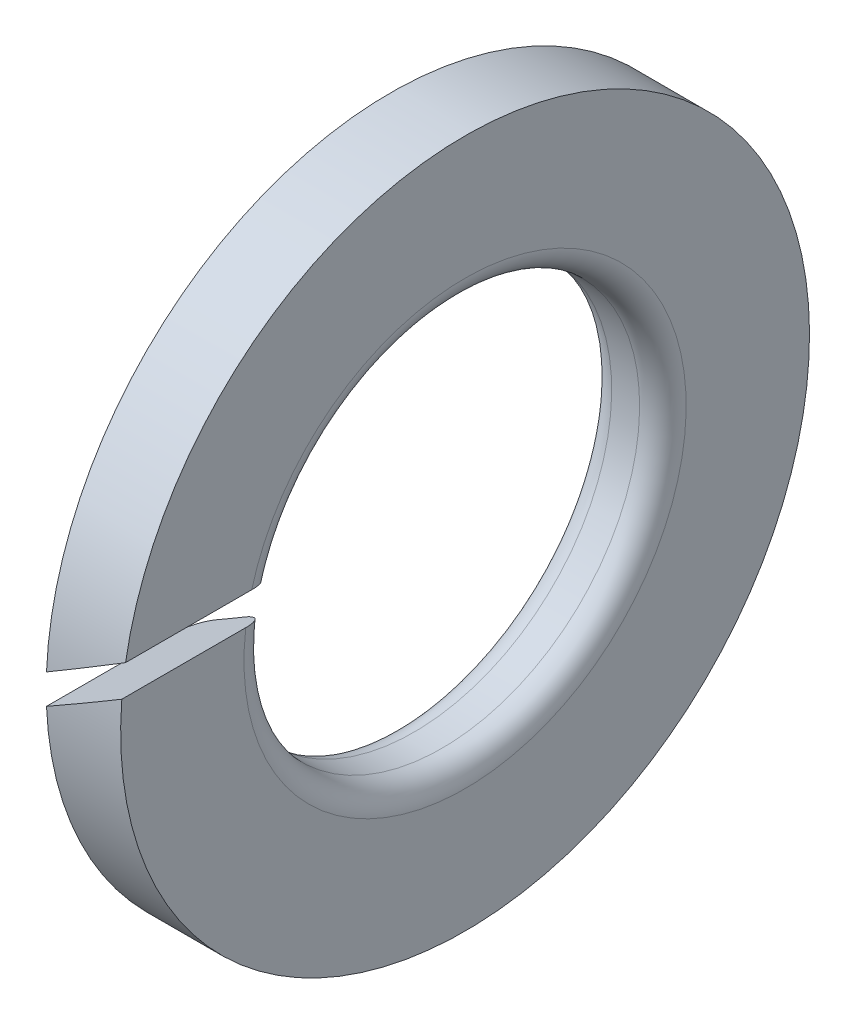
ISO-10303-21;
HEADER;
FILE_DESCRIPTION(('STEP AP214'),'2;1');
FILE_NAME('part.step','',(''),(''),'','','');
FILE_SCHEMA(('AUTOMOTIVE_DESIGN { 1 0 10303 214 1 1 1 1 }'));
ENDSEC;
DATA;
#1=APPLICATION_CONTEXT('core data for automotive mechanical design processes');
#2=APPLICATION_PROTOCOL_DEFINITION('international standard','automotive_design',2000,#1);
#3=PRODUCT_CONTEXT('',#1,'mechanical');
#4=PRODUCT('Part','Part','',(#3));
#5=PRODUCT_RELATED_PRODUCT_CATEGORY('part','',(#4));
#6=PRODUCT_DEFINITION_FORMATION('','',#4);
#7=PRODUCT_DEFINITION_CONTEXT('part definition',#1,'design');
#8=PRODUCT_DEFINITION('design','',#6,#7);
#9=PRODUCT_DEFINITION_SHAPE('','',#8);
#10=(LENGTH_UNIT() NAMED_UNIT(*) SI_UNIT(.MILLI.,.METRE.));
#11=(NAMED_UNIT(*) PLANE_ANGLE_UNIT() SI_UNIT($,.RADIAN.));
#12=(NAMED_UNIT(*) SI_UNIT($,.STERADIAN.) SOLID_ANGLE_UNIT());
#13=UNCERTAINTY_MEASURE_WITH_UNIT(LENGTH_MEASURE(1.E-05),#10,'distance_accuracy_value','');
#14=(GEOMETRIC_REPRESENTATION_CONTEXT(3) GLOBAL_UNCERTAINTY_ASSIGNED_CONTEXT((#13)) GLOBAL_UNIT_ASSIGNED_CONTEXT((#10,
#11,#12)) REPRESENTATION_CONTEXT('',''));
#15=CARTESIAN_POINT('',(0.,0.,0.));
#16=DIRECTION('',(0.,0.,1.));
#17=DIRECTION('',(1.,0.,0.));
#18=AXIS2_PLACEMENT_3D('',#15,#16,#17);
#19=CARTESIAN_POINT('',(0.499999999999997,0.,0.));
#20=DIRECTION('',(1.,0.,0.));
#21=DIRECTION('',(0.,0.,-1.));
#22=AXIS2_PLACEMENT_3D('',#19,#20,#21);
#23=CYLINDRICAL_SURFACE('',#22,4.25);
#24=CARTESIAN_POINT('',(0.55425625842204,0.,0.));
#25=DIRECTION('',(-0.500000000000001,0.866025403784438,0.));
#26=DIRECTION('',(0.866025403784438,0.500000000000001,0.));
#27=AXIS2_PLACEMENT_3D('',#24,#25,#26);
#28=ELLIPSE('',#27,8.49999999999999,4.25);
#29=CARTESIAN_POINT('',(0.5,-0.0313248654051858,4.24988455758593));
#30=VERTEX_POINT('',#29);
#31=CARTESIAN_POINT('',(1.1,0.31508529610859,4.2383040542387));
#32=VERTEX_POINT('',#31);
#33=EDGE_CURVE('E20',#30,#32,#28,.T.);
#34=ORIENTED_EDGE('',*,*,#33,.T.);
#35=CARTESIAN_POINT('',(1.1,0.,0.));
#36=DIRECTION('',(-1.,0.,0.));
#37=DIRECTION('',(0.,-0.177074351954088,-0.984197477074616));
#38=AXIS2_PLACEMENT_3D('',#35,#36,#37);
#39=CIRCLE('',#38,4.25);
#40=CARTESIAN_POINT('',(1.1,0.955085296108589,4.14129352704649));
#41=VERTEX_POINT('',#40);
#42=EDGE_CURVE('E181',#41,#32,#39,.T.);
#43=ORIENTED_EDGE('',*,*,#42,.F.);
#44=CARTESIAN_POINT('',(-0.554256258422041,0.,0.));
#45=DIRECTION('',(0.5,-0.866025403784439,0.));
#46=DIRECTION('',(0.866025403784438,0.5,0.));
#47=AXIS2_PLACEMENT_3D('',#44,#45,#46);
#48=ELLIPSE('',#47,8.5,4.25);
#49=CARTESIAN_POINT('',(0.499999999999999,0.608675134594812,4.20618765398383));
#50=VERTEX_POINT('',#49);
#51=EDGE_CURVE('E151',#50,#41,#48,.F.);
#52=ORIENTED_EDGE('',*,*,#51,.F.);
#53=CARTESIAN_POINT('',(0.5,0.,0.));
#54=DIRECTION('',(1.,0.,0.));
#55=DIRECTION('',(0.,0.,-1.));
#56=AXIS2_PLACEMENT_3D('',#53,#54,#55);
#57=CIRCLE('',#56,4.25);
#58=EDGE_CURVE('E147',#30,#50,#57,.T.);
#59=ORIENTED_EDGE('',*,*,#58,.F.);
#60=EDGE_LOOP('',(#34,#43,#52,#59));
#61=FACE_BOUND('',#60,.T.);
#62=ADVANCED_FACE('F17',(#61),#23,.F.);
#63=CARTESIAN_POINT('',(1.1,0.,0.));
#64=DIRECTION('',(-1.,0.,0.));
#65=DIRECTION('',(0.,-0.177074351954088,-0.984197477074616));
#66=AXIS2_PLACEMENT_3D('',#63,#64,#65);
#67=TOROIDAL_SURFACE('',#66,4.75,0.5);
#68=CARTESIAN_POINT('',(1.1,0.31508529610859,4.23830405423869));
#69=CARTESIAN_POINT('',(1.13678172088831,0.336321232564711,4.23671970242913));
#70=CARTESIAN_POINT('',(1.17382927199748,0.357710646170411,4.23905009510881));
#71=CARTESIAN_POINT('',(1.24701719856397,0.399965715275003,4.25190332171759));
#72=CARTESIAN_POINT('',(1.28315205361728,0.420828183567161,4.26246743209476));
#73=CARTESIAN_POINT('',(1.34256751918806,0.455131718608475,4.28785632269839));
#74=CARTESIAN_POINT('',(1.36653135164932,0.468967243730797,4.30054994700496));
#75=CARTESIAN_POINT('',(1.41229794166168,0.495390596794328,4.33029267934188));
#76=CARTESIAN_POINT('',(1.4341054429834,0.507981163552778,4.34733191753642));
#77=CARTESIAN_POINT('',(1.4749104178919,0.531539926800475,4.38582522446512));
#78=CARTESIAN_POINT('',(1.49388290616121,0.542493698009958,4.40731497046341));
#79=CARTESIAN_POINT('',(1.52782196016706,0.562088419976276,4.45419436341069));
#80=CARTESIAN_POINT('',(1.54279011469234,0.570730288020721,4.4795824573107));
#81=CARTESIAN_POINT('',(1.56614012332023,0.584211421787611,4.52972288828311));
#82=CARTESIAN_POINT('',(1.57514033238327,0.589407694912917,4.55409343087371));
#83=CARTESIAN_POINT('',(1.58910588769238,0.597470712030019,4.60431238234732));
#84=CARTESIAN_POINT('',(1.5940779596821,0.600341339131718,4.63015825031143));
#85=CARTESIAN_POINT('',(1.59798294095501,0.602595881120806,4.66543224433156));
#86=CARTESIAN_POINT('',(1.59874099782887,0.603033545460984,4.67462805174592));
#87=CARTESIAN_POINT('',(1.59974872549478,0.603615357300178,4.69303863121975));
#88=CARTESIAN_POINT('',(1.59999939471476,0.603760081241829,4.70225333024734));
#89=CARTESIAN_POINT('',(1.6,0.603760430703464,4.71147252377817));
#90=B_SPLINE_CURVE_WITH_KNOTS('',3,(#68,#69,#70,#71,#72,#73,#74,#75,#76,#77,#78,#79,#80,#81,#82,
#83,#84,#85,#86,#87,#88,#89),.UNSPECIFIED.,.F.,.F.,(4,2,2,2,2,2,2,2,2,2,4),(0.,
0.127600280687671,0.255844381255259,0.346809853536553,0.437570535259042,0.529089100479913,
0.620571300089452,0.699631208328685,0.778558837316882,0.806257239677718,0.833901084445332),.UNSPECIFIED.);
#91=CARTESIAN_POINT('',(1.6,0.603760430703404,4.71147252377819));
#92=VERTEX_POINT('',#91);
#93=EDGE_CURVE('E67',#32,#92,#90,.T.);
#94=ORIENTED_EDGE('',*,*,#93,.T.);
#95=CARTESIAN_POINT('',(1.6,0.,0.));
#96=DIRECTION('',(1.,0.,0.));
#97=DIRECTION('',(0.,0.127107459095454,0.991888952374356));
#98=AXIS2_PLACEMENT_3D('',#95,#96,#97);
#99=CIRCLE('',#98,4.75);
#100=CARTESIAN_POINT('',(1.6,1.2437604307034,4.58427311479328));
#101=VERTEX_POINT('',#100);
#102=EDGE_CURVE('E83',#101,#92,#99,.F.);
#103=ORIENTED_EDGE('',*,*,#102,.F.);
#104=CARTESIAN_POINT('',(1.1,0.95508529610859,4.14129352704649));
#105=CARTESIAN_POINT('',(1.12984976308227,0.972319064859382,4.13731755602656));
#106=CARTESIAN_POINT('',(1.1600507732419,0.989755626204842,4.1359312901601));
#107=CARTESIAN_POINT('',(1.22042371802115,1.02461196212492,4.1388338516043));
#108=CARTESIAN_POINT('',(1.25059430231673,1.04203095708958,4.14315804632588));
#109=CARTESIAN_POINT('',(1.3044846850627,1.07314458407469,4.15670760280906));
#110=CARTESIAN_POINT('',(1.32839269620185,1.08694788074167,4.16491742700621));
#111=CARTESIAN_POINT('',(1.37468974252266,1.11367749289768,4.18574876431477));
#112=CARTESIAN_POINT('',(1.39708183663634,1.12660557446193,4.19836105651868));
#113=CARTESIAN_POINT('',(1.43973777389713,1.15123299132198,4.22818437940016));
#114=CARTESIAN_POINT('',(1.45998120600015,1.16292054229598,4.24543481270876));
#115=CARTESIAN_POINT('',(1.49713555099979,1.18437161338309,4.28420067676093));
#116=CARTESIAN_POINT('',(1.51404952935001,1.19413690333666,4.3057121473688));
#117=CARTESIAN_POINT('',(1.5416473822135,1.21007053111644,4.34906890050404));
#118=CARTESIAN_POINT('',(1.55286828045192,1.21654891973495,4.37046093111359));
#119=CARTESIAN_POINT('',(1.571831883497,1.22749756105783,4.41522847700062));
#120=CARTESIAN_POINT('',(1.57957316029692,1.23196698930213,4.43860480194531));
#121=CARTESIAN_POINT('',(1.59036840398876,1.23819962615359,4.48234630726082));
#122=CARTESIAN_POINT('',(1.5940046758717,1.24029902870405,4.50252487565988));
#123=CARTESIAN_POINT('',(1.59882365875394,1.24308126976833,4.54323042831559));
#124=CARTESIAN_POINT('',(1.60001122843743,1.24376691344478,4.56375664098541));
#125=CARTESIAN_POINT('',(1.6,1.2437604307034,4.58427311479328));
#126=B_SPLINE_CURVE_WITH_KNOTS('',3,(#104,#105,#106,#107,#108,#109,#110,#111,#112,#113,#114,
#115,#116,#117,#118,#119,#120,#121,#122,#123,#124,#125),.UNSPECIFIED.,.F.,.F.,(4,2,2,2,2,2,2,2,
2,2,4),(0.,0.104162501105163,0.20897316193909,0.295027961650513,0.38090359171016,
0.467533169950083,0.554082610726189,0.628722483425022,0.703392959781538,0.765029931524329,
0.826544485811097),.UNSPECIFIED.);
#127=EDGE_CURVE('E74',#41,#101,#126,.T.);
#128=ORIENTED_EDGE('',*,*,#127,.F.);
#129=ORIENTED_EDGE('',*,*,#42,.T.);
#130=EDGE_LOOP('',(#94,#103,#128,#129));
#131=FACE_BOUND('',#130,.T.);
#132=ADVANCED_FACE('F170',(#131),#67,.T.);
#133=CARTESIAN_POINT('',(0.,0.32,0.));
#134=DIRECTION('',(0.5,-0.866025403784439,0.));
#135=DIRECTION('',(0.866025403784438,0.5,0.));
#136=AXIS2_PLACEMENT_3D('',#133,#134,#135);
#137=PLANE('',#136);
#138=CARTESIAN_POINT('',(0.499999999999999,0.608675134594812,4.20618765398383));
#139=CARTESIAN_POINT('',(0.463171048910905,0.587411929769552,4.20928927896614));
#140=CARTESIAN_POINT('',(0.426570875187606,0.566280809618019,4.21627051753602));
#141=CARTESIAN_POINT('',(0.35514473607236,0.525042908972656,4.23769576230147));
#142=CARTESIAN_POINT('',(0.320314689139784,0.504933772000246,4.25212165690988));
#143=CARTESIAN_POINT('',(0.255885643392651,0.467735645094508,4.28689950390754));
#144=CARTESIAN_POINT('',(0.226091205047957,0.450533818095845,4.30676740986838));
#145=CARTESIAN_POINT('',(0.170259885139486,0.418299590517477,4.35250398149588));
#146=CARTESIAN_POINT('',(0.144210871766249,0.403260185634315,4.37835253126997));
#147=CARTESIAN_POINT('',(0.103378575031747,0.379685648123019,4.42815171035303));
#148=CARTESIAN_POINT('',(0.0874300442493077,0.370477759582599,4.45083377602129));
#149=CARTESIAN_POINT('',(0.0589967579520645,0.35406179408494,4.49891311272654));
#150=CARTESIAN_POINT('',(0.0465063286356793,0.346850441356832,4.52430584029321));
#151=CARTESIAN_POINT('',(0.0268793242331259,0.335518785081631,4.57411437341599));
#152=CARTESIAN_POINT('',(0.0192834361011675,0.33113329702391,4.59828879324037));
#153=CARTESIAN_POINT('',(0.00770694899014335,0.32444960907409,4.64773390677805));
#154=CARTESIAN_POINT('',(0.00371829950537697,0.322146761220358,4.67300202677879));
#155=CARTESIAN_POINT('',(0.000549781188376998,0.320317416317104,4.712008216898));
#156=CARTESIAN_POINT('',(-6.75395013721039E-06,0.319996100605067,4.72561064933918));
#157=CARTESIAN_POINT('',(0.,0.319999999999994,4.73920879472513));
#158=B_SPLINE_CURVE_WITH_KNOTS('',3,(#138,#139,#140,#141,#142,#143,#144,#145,#146,#147,#148,
#149,#150,#151,#152,#153,#154,#155,#156,#157),.UNSPECIFIED.,.F.,.F.,(4,2,2,2,2,2,2,2,2,4),(0.,
0.12778218225729,0.255254947464821,0.37382812197778,0.492008128943393,0.579311659998546,
0.666471089238071,0.743292104631159,0.819941247495982,0.860735190470742),.UNSPECIFIED.);
#159=CARTESIAN_POINT('',(0.,0.320000000000001,4.73920879472513));
#160=VERTEX_POINT('',#159);
#161=EDGE_CURVE('E91',#50,#160,#158,.T.);
#162=ORIENTED_EDGE('',*,*,#161,.F.);
#163=ORIENTED_EDGE('',*,*,#51,.T.);
#164=ORIENTED_EDGE('',*,*,#127,.T.);
#165=DIRECTION('',(0.,0.,-1.));
#166=VECTOR('',#165,1.);
#167=CARTESIAN_POINT('',(1.6,1.2437604307034,0.));
#168=LINE('',#167,#166);
#169=CARTESIAN_POINT('',(1.6,1.2437604307034,7.29472823284161));
#170=VERTEX_POINT('',#169);
#171=EDGE_CURVE('E123',#170,#101,#168,.T.);
#172=ORIENTED_EDGE('',*,*,#171,.F.);
#173=CARTESIAN_POINT('',(-0.554256258422041,0.,0.));
#174=DIRECTION('',(0.5,-0.866025403784439,0.));
#175=DIRECTION('',(0.866025403784438,0.5,0.));
#176=AXIS2_PLACEMENT_3D('',#173,#174,#175);
#177=ELLIPSE('',#176,14.8,7.4);
#178=CARTESIAN_POINT('',(0.,0.32,7.39307784349658));
#179=VERTEX_POINT('',#178);
#180=EDGE_CURVE('E148',#179,#170,#177,.F.);
#181=ORIENTED_EDGE('',*,*,#180,.F.);
#182=DIRECTION('',(0.,0.,1.));
#183=VECTOR('',#182,1.);
#184=CARTESIAN_POINT('',(0.,0.32,0.));
#185=LINE('',#184,#183);
#186=EDGE_CURVE('E100',#160,#179,#185,.T.);
#187=ORIENTED_EDGE('',*,*,#186,.F.);
#188=EDGE_LOOP('',(#162,#163,#164,#172,#181,#187));
#189=FACE_BOUND('',#188,.T.);
#190=ADVANCED_FACE('F140',(#189),#137,.T.);
#191=CARTESIAN_POINT('',(0.5,0.,0.));
#192=DIRECTION('',(1.,0.,0.));
#193=DIRECTION('',(0.,0.,-1.));
#194=AXIS2_PLACEMENT_3D('',#191,#192,#193);
#195=TOROIDAL_SURFACE('',#194,4.75,0.5);
#196=CARTESIAN_POINT('',(0.500000000000001,-0.0313248654051854,4.24988455758593));
#197=CARTESIAN_POINT('',(0.463045921468308,-0.0526603125931122,4.24973089864174));
#198=CARTESIAN_POINT('',(0.425979345258916,-0.0740607103455436,4.25351015168698));
#199=CARTESIAN_POINT('',(0.353260737344647,-0.116044818199943,4.26904166842645));
#200=CARTESIAN_POINT('',(0.317604442782533,-0.136630989463686,4.28076759017846));
#201=CARTESIAN_POINT('',(0.257748754867034,-0.171188686994229,4.30830916520091));
#202=CARTESIAN_POINT('',(0.232932807696766,-0.185516180773178,4.32233998051569));
#203=CARTESIAN_POINT('',(0.185660029362895,-0.212809132069579,4.35490960076106));
#204=CARTESIAN_POINT('',(0.163198829475635,-0.225777111870809,4.37343983821113));
#205=CARTESIAN_POINT('',(0.121327780301832,-0.249951373382557,4.41505376600337));
#206=CARTESIAN_POINT('',(0.101945464028363,-0.261141758900564,4.43817478942806));
#207=CARTESIAN_POINT('',(0.0675154064491417,-0.281019961912142,4.48841582762945));
#208=CARTESIAN_POINT('',(0.0524657187725086,-0.289708903143465,4.51553403842286));
#209=CARTESIAN_POINT('',(0.0294693781858365,-0.302985846571557,4.56869611853088));
#210=CARTESIAN_POINT('',(0.0208114396627187,-0.307984509708506,4.59433110511176));
#211=CARTESIAN_POINT('',(0.0078446748879215,-0.315470874841754,4.64698387816232));
#212=CARTESIAN_POINT('',(0.0035250794438411,-0.317964794434184,4.67399806477173));
#213=CARTESIAN_POINT('',(0.000476746254438413,-0.319724750421668,4.71385149448012));
#214=CARTESIAN_POINT('',(-7.20592680616443E-06,-0.320004160343786,4.72653484928437));
#215=CARTESIAN_POINT('',(0.,-0.320000000000006,4.73920879472513));
#216=B_SPLINE_CURVE_WITH_KNOTS('',3,(#196,#197,#198,#199,#200,#201,#202,#203,#204,#205,#206,
#207,#208,#209,#210,#211,#212,#213,#214,#215),.UNSPECIFIED.,.F.,.F.,(4,2,2,2,2,2,2,2,2,4),(0.,
0.128034064297744,0.255645778652114,0.350977186968327,0.446128476178684,0.542087822715789,
0.638003993391358,0.720090239975802,0.80197221413606,0.840006526303736),.UNSPECIFIED.);
#217=CARTESIAN_POINT('',(0.,-0.320000000000001,4.73920879472513));
#218=VERTEX_POINT('',#217);
#219=EDGE_CURVE('E77',#30,#218,#216,.T.);
#220=ORIENTED_EDGE('',*,*,#219,.F.);
#221=ORIENTED_EDGE('',*,*,#58,.T.);
#222=ORIENTED_EDGE('',*,*,#161,.T.);
#223=CARTESIAN_POINT('',(0.,0.,0.));
#224=DIRECTION('',(-1.,0.,0.));
#225=DIRECTION('',(0.,0.0673684210526323,0.997728167310553));
#226=AXIS2_PLACEMENT_3D('',#223,#224,#225);
#227=CIRCLE('',#226,4.75000000000001);
#228=EDGE_CURVE('E87',#218,#160,#227,.F.);
#229=ORIENTED_EDGE('',*,*,#228,.F.);
#230=EDGE_LOOP('',(#220,#221,#222,#229));
#231=FACE_BOUND('',#230,.T.);
#232=ADVANCED_FACE('F89',(#231),#195,.T.);
#233=CARTESIAN_POINT('',(1.6,0.,0.));
#234=DIRECTION('',(1.,0.,0.));
#235=DIRECTION('',(0.,0.,-1.));
#236=AXIS2_PLACEMENT_3D('',#233,#234,#235);
#237=PLANE('',#236);
#238=CARTESIAN_POINT('',(1.6,0.,0.));
#239=DIRECTION('',(1.,0.,0.));
#240=DIRECTION('',(0.,0.,-1.));
#241=AXIS2_PLACEMENT_3D('',#238,#239,#240);
#242=CIRCLE('',#241,7.4);
#243=CARTESIAN_POINT('',(1.6,0.603760430703403,7.3753286938493));
#244=VERTEX_POINT('',#243);
#245=EDGE_CURVE('E95',#170,#244,#242,.F.);
#246=ORIENTED_EDGE('',*,*,#245,.F.);
#247=ORIENTED_EDGE('',*,*,#171,.T.);
#248=ORIENTED_EDGE('',*,*,#102,.T.);
#249=DIRECTION('',(0.,0.,1.));
#250=VECTOR('',#249,1.);
#251=CARTESIAN_POINT('',(1.6,0.603760430703403,0.));
#252=LINE('',#251,#250);
#253=EDGE_CURVE('E82',#244,#92,#252,.F.);
#254=ORIENTED_EDGE('',*,*,#253,.F.);
#255=EDGE_LOOP('',(#246,#247,#248,#254));
#256=FACE_BOUND('',#255,.T.);
#257=ADVANCED_FACE('F125',(#256),#237,.T.);
#258=CARTESIAN_POINT('',(1.6,0.603760430703403,0.));
#259=DIRECTION('',(-0.500000000000001,0.866025403784438,0.));
#260=DIRECTION('',(-0.866025403784438,-0.500000000000001,0.));
#261=AXIS2_PLACEMENT_3D('',#258,#259,#260);
#262=PLANE('',#261);
#263=CARTESIAN_POINT('',(0.55425625842204,0.,0.));
#264=DIRECTION('',(-0.500000000000001,0.866025403784438,0.));
#265=DIRECTION('',(0.866025403784438,0.500000000000001,0.));
#266=AXIS2_PLACEMENT_3D('',#263,#264,#265);
#267=ELLIPSE('',#266,14.8,7.4);
#268=CARTESIAN_POINT('',(0.,-0.319999999999998,7.39307784349658));
#269=VERTEX_POINT('',#268);
#270=EDGE_CURVE('E26',#244,#269,#267,.F.);
#271=ORIENTED_EDGE('',*,*,#270,.F.);
#272=ORIENTED_EDGE('',*,*,#253,.T.);
#273=ORIENTED_EDGE('',*,*,#93,.F.);
#274=ORIENTED_EDGE('',*,*,#33,.F.);
#275=ORIENTED_EDGE('',*,*,#219,.T.);
#276=DIRECTION('',(0.,0.,1.));
#277=VECTOR('',#276,1.);
#278=CARTESIAN_POINT('',(0.,-0.32,0.));
#279=LINE('',#278,#277);
#280=EDGE_CURVE('E35',#269,#218,#279,.F.);
#281=ORIENTED_EDGE('',*,*,#280,.F.);
#282=EDGE_LOOP('',(#271,#272,#273,#274,#275,#281));
#283=FACE_BOUND('',#282,.T.);
#284=ADVANCED_FACE('F79',(#283),#262,.T.);
#285=CARTESIAN_POINT('',(0.,0.,0.));
#286=DIRECTION('',(-1.,0.,0.));
#287=DIRECTION('',(0.,0.,1.));
#288=AXIS2_PLACEMENT_3D('',#285,#286,#287);
#289=PLANE('',#288);
#290=ORIENTED_EDGE('',*,*,#280,.T.);
#291=ORIENTED_EDGE('',*,*,#228,.T.);
#292=ORIENTED_EDGE('',*,*,#186,.T.);
#293=CARTESIAN_POINT('',(0.,0.,0.));
#294=DIRECTION('',(1.,0.,0.));
#295=DIRECTION('',(0.,0.,-1.));
#296=AXIS2_PLACEMENT_3D('',#293,#294,#295);
#297=CIRCLE('',#296,7.4);
#298=EDGE_CURVE('E11',#269,#179,#297,.T.);
#299=ORIENTED_EDGE('',*,*,#298,.F.);
#300=EDGE_LOOP('',(#290,#291,#292,#299));
#301=FACE_BOUND('',#300,.T.);
#302=ADVANCED_FACE('F98',(#301),#289,.T.);
#303=CARTESIAN_POINT('',(0.,0.,0.));
#304=DIRECTION('',(1.,0.,0.));
#305=DIRECTION('',(0.,0.,-1.));
#306=AXIS2_PLACEMENT_3D('',#303,#304,#305);
#307=CYLINDRICAL_SURFACE('',#306,7.4);
#308=ORIENTED_EDGE('',*,*,#270,.T.);
#309=ORIENTED_EDGE('',*,*,#298,.T.);
#310=ORIENTED_EDGE('',*,*,#180,.T.);
#311=ORIENTED_EDGE('',*,*,#245,.T.);
#312=EDGE_LOOP('',(#308,#309,#310,#311));
#313=FACE_BOUND('',#312,.T.);
#314=ADVANCED_FACE('F194',(#313),#307,.T.);
#315=CLOSED_SHELL('',(#62,#132,#190,#232,#257,#284,#302,#314));
#316=MANIFOLD_SOLID_BREP('B1',#315);
#317=ADVANCED_BREP_SHAPE_REPRESENTATION('',(#18,#316),#14);
#318=SHAPE_DEFINITION_REPRESENTATION(#9,#317);
ENDSEC;
END-ISO-10303-21;
